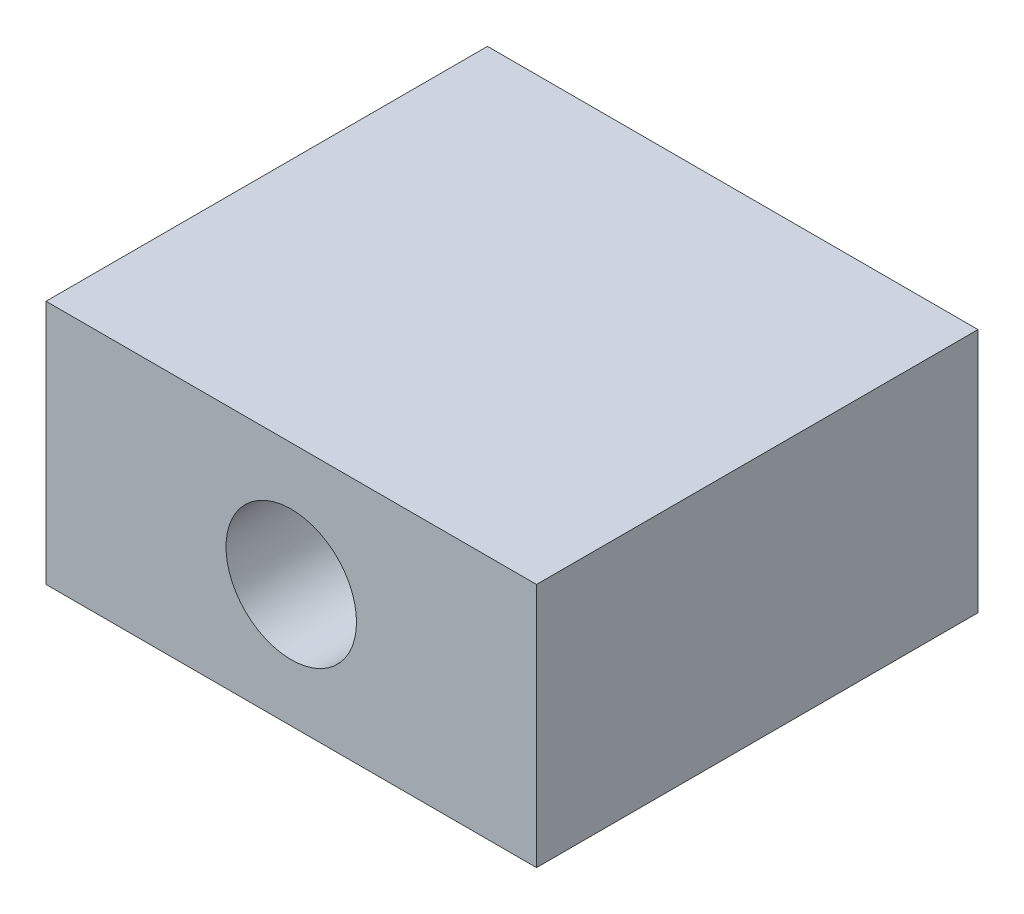
ISO-10303-21;
HEADER;
FILE_DESCRIPTION(('STEP AP214'),'2;1');
FILE_NAME('part.step','',(''),(''),'','','');
FILE_SCHEMA(('AUTOMOTIVE_DESIGN { 1 0 10303 214 1 1 1 1 }'));
ENDSEC;
DATA;
#1=APPLICATION_CONTEXT('core data for automotive mechanical design processes');
#2=APPLICATION_PROTOCOL_DEFINITION('international standard','automotive_design',2000,#1);
#3=PRODUCT_CONTEXT('',#1,'mechanical');
#4=PRODUCT('Part','Part','',(#3));
#5=PRODUCT_RELATED_PRODUCT_CATEGORY('part','',(#4));
#6=PRODUCT_DEFINITION_FORMATION('','',#4);
#7=PRODUCT_DEFINITION_CONTEXT('part definition',#1,'design');
#8=PRODUCT_DEFINITION('design','',#6,#7);
#9=PRODUCT_DEFINITION_SHAPE('','',#8);
#10=(LENGTH_UNIT() NAMED_UNIT(*) SI_UNIT(.MILLI.,.METRE.));
#11=(NAMED_UNIT(*) PLANE_ANGLE_UNIT() SI_UNIT($,.RADIAN.));
#12=(NAMED_UNIT(*) SI_UNIT($,.STERADIAN.) SOLID_ANGLE_UNIT());
#13=UNCERTAINTY_MEASURE_WITH_UNIT(LENGTH_MEASURE(1.E-05),#10,'distance_accuracy_value','');
#14=(GEOMETRIC_REPRESENTATION_CONTEXT(3) GLOBAL_UNCERTAINTY_ASSIGNED_CONTEXT((#13)) GLOBAL_UNIT_ASSIGNED_CONTEXT((#10,
#11,#12)) REPRESENTATION_CONTEXT('',''));
#15=CARTESIAN_POINT('',(0.,0.,0.));
#16=DIRECTION('',(0.,0.,1.));
#17=DIRECTION('',(1.,0.,0.));
#18=AXIS2_PLACEMENT_3D('',#15,#16,#17);
#19=CARTESIAN_POINT('',(12.7,-6.35,22.86));
#20=DIRECTION('',(-1.,0.,0.));
#21=DIRECTION('',(0.,0.,1.));
#22=AXIS2_PLACEMENT_3D('',#19,#20,#21);
#23=PLANE('',#22);
#24=DIRECTION('',(0.,1.,0.));
#25=VECTOR('',#24,1.);
#26=CARTESIAN_POINT('',(12.7,-6.35,0.));
#27=LINE('',#26,#25);
#28=CARTESIAN_POINT('',(12.7,-6.35,0.));
#29=VERTEX_POINT('',#28);
#30=CARTESIAN_POINT('',(12.7,6.35,0.));
#31=VERTEX_POINT('',#30);
#32=EDGE_CURVE('E97',#29,#31,#27,.T.);
#33=ORIENTED_EDGE('',*,*,#32,.T.);
#34=DIRECTION('',(0.,0.,-1.));
#35=VECTOR('',#34,1.);
#36=CARTESIAN_POINT('',(12.7,6.35,22.86));
#37=LINE('',#36,#35);
#38=CARTESIAN_POINT('',(12.7,6.35,22.86));
#39=VERTEX_POINT('',#38);
#40=EDGE_CURVE('E11',#39,#31,#37,.T.);
#41=ORIENTED_EDGE('',*,*,#40,.F.);
#42=DIRECTION('',(0.,1.,0.));
#43=VECTOR('',#42,1.);
#44=CARTESIAN_POINT('',(12.7,-6.35,22.86));
#45=LINE('',#44,#43);
#46=CARTESIAN_POINT('',(12.7,-6.35,22.86));
#47=VERTEX_POINT('',#46);
#48=EDGE_CURVE('E85',#47,#39,#45,.T.);
#49=ORIENTED_EDGE('',*,*,#48,.F.);
#50=DIRECTION('',(0.,0.,-1.));
#51=VECTOR('',#50,1.);
#52=CARTESIAN_POINT('',(12.7,-6.35,22.86));
#53=LINE('',#52,#51);
#54=EDGE_CURVE('E93',#47,#29,#53,.T.);
#55=ORIENTED_EDGE('',*,*,#54,.T.);
#56=EDGE_LOOP('',(#33,#41,#49,#55));
#57=FACE_BOUND('',#56,.T.);
#58=ADVANCED_FACE('F34',(#57),#23,.F.);
#59=CARTESIAN_POINT('',(-12.7,6.35,22.86));
#60=DIRECTION('',(0.,-1.,0.));
#61=DIRECTION('',(0.,0.,-1.));
#62=AXIS2_PLACEMENT_3D('',#59,#60,#61);
#63=PLANE('',#62);
#64=DIRECTION('',(-1.,0.,0.));
#65=VECTOR('',#64,1.);
#66=CARTESIAN_POINT('',(-12.7,6.35,0.));
#67=LINE('',#66,#65);
#68=CARTESIAN_POINT('',(-12.7,6.35,0.));
#69=VERTEX_POINT('',#68);
#70=EDGE_CURVE('E89',#31,#69,#67,.T.);
#71=ORIENTED_EDGE('',*,*,#70,.T.);
#72=DIRECTION('',(0.,0.,-1.));
#73=VECTOR('',#72,1.);
#74=CARTESIAN_POINT('',(-12.7,6.35,22.86));
#75=LINE('',#74,#73);
#76=CARTESIAN_POINT('',(-12.7,6.35,22.86));
#77=VERTEX_POINT('',#76);
#78=EDGE_CURVE('E42',#77,#69,#75,.T.);
#79=ORIENTED_EDGE('',*,*,#78,.F.);
#80=DIRECTION('',(-1.,0.,0.));
#81=VECTOR('',#80,1.);
#82=CARTESIAN_POINT('',(-12.7,6.35,22.86));
#83=LINE('',#82,#81);
#84=EDGE_CURVE('E80',#39,#77,#83,.T.);
#85=ORIENTED_EDGE('',*,*,#84,.F.);
#86=ORIENTED_EDGE('',*,*,#40,.T.);
#87=EDGE_LOOP('',(#71,#79,#85,#86));
#88=FACE_BOUND('',#87,.T.);
#89=ADVANCED_FACE('F88',(#88),#63,.F.);
#90=CARTESIAN_POINT('',(-12.7,-6.35,22.86));
#91=DIRECTION('',(1.,0.,0.));
#92=DIRECTION('',(0.,0.,-1.));
#93=AXIS2_PLACEMENT_3D('',#90,#91,#92);
#94=PLANE('',#93);
#95=DIRECTION('',(0.,-1.,0.));
#96=VECTOR('',#95,1.);
#97=CARTESIAN_POINT('',(-12.7,-6.35,0.));
#98=LINE('',#97,#96);
#99=CARTESIAN_POINT('',(-12.7,-6.35,0.));
#100=VERTEX_POINT('',#99);
#101=EDGE_CURVE('E67',#69,#100,#98,.T.);
#102=ORIENTED_EDGE('',*,*,#101,.T.);
#103=DIRECTION('',(0.,0.,-1.));
#104=VECTOR('',#103,1.);
#105=CARTESIAN_POINT('',(-12.7,-6.35,22.86));
#106=LINE('',#105,#104);
#107=CARTESIAN_POINT('',(-12.7,-6.35,22.86));
#108=VERTEX_POINT('',#107);
#109=EDGE_CURVE('E90',#108,#100,#106,.T.);
#110=ORIENTED_EDGE('',*,*,#109,.F.);
#111=DIRECTION('',(0.,-1.,0.));
#112=VECTOR('',#111,1.);
#113=CARTESIAN_POINT('',(-12.7,-6.35,22.86));
#114=LINE('',#113,#112);
#115=EDGE_CURVE('E83',#77,#108,#114,.T.);
#116=ORIENTED_EDGE('',*,*,#115,.F.);
#117=ORIENTED_EDGE('',*,*,#78,.T.);
#118=EDGE_LOOP('',(#102,#110,#116,#117));
#119=FACE_BOUND('',#118,.T.);
#120=ADVANCED_FACE('F91',(#119),#94,.F.);
#121=CARTESIAN_POINT('',(-12.7,-6.35,22.86));
#122=DIRECTION('',(0.,1.,0.));
#123=DIRECTION('',(0.,0.,1.));
#124=AXIS2_PLACEMENT_3D('',#121,#122,#123);
#125=PLANE('',#124);
#126=DIRECTION('',(1.,0.,0.));
#127=VECTOR('',#126,1.);
#128=CARTESIAN_POINT('',(-12.7,-6.35,0.));
#129=LINE('',#128,#127);
#130=EDGE_CURVE('E73',#100,#29,#129,.T.);
#131=ORIENTED_EDGE('',*,*,#130,.T.);
#132=ORIENTED_EDGE('',*,*,#54,.F.);
#133=DIRECTION('',(1.,0.,0.));
#134=VECTOR('',#133,1.);
#135=CARTESIAN_POINT('',(-12.7,-6.35,22.86));
#136=LINE('',#135,#134);
#137=EDGE_CURVE('E50',#108,#47,#136,.T.);
#138=ORIENTED_EDGE('',*,*,#137,.F.);
#139=ORIENTED_EDGE('',*,*,#109,.T.);
#140=EDGE_LOOP('',(#131,#132,#138,#139));
#141=FACE_BOUND('',#140,.T.);
#142=ADVANCED_FACE('F105',(#141),#125,.F.);
#143=CARTESIAN_POINT('',(12.7,6.35,22.86));
#144=DIRECTION('',(0.,0.,-1.));
#145=DIRECTION('',(-1.,0.,0.));
#146=AXIS2_PLACEMENT_3D('',#143,#144,#145);
#147=PLANE('',#146);
#148=CARTESIAN_POINT('',(0.,0.,22.86));
#149=DIRECTION('',(0.,0.,1.));
#150=DIRECTION('',(1.,0.,0.));
#151=AXIS2_PLACEMENT_3D('',#148,#149,#150);
#152=CIRCLE('',#151,3.37819999999999);
#153=CARTESIAN_POINT('',(3.37819999999999,0.,22.86));
#154=VERTEX_POINT('',#153);
#155=EDGE_CURVE('E113',#154,#154,#152,.T.);
#156=ORIENTED_EDGE('',*,*,#155,.F.);
#157=EDGE_LOOP('',(#156));
#158=FACE_BOUND('',#157,.T.);
#159=ORIENTED_EDGE('',*,*,#48,.T.);
#160=ORIENTED_EDGE('',*,*,#84,.T.);
#161=ORIENTED_EDGE('',*,*,#115,.T.);
#162=ORIENTED_EDGE('',*,*,#137,.T.);
#163=EDGE_LOOP('',(#159,#160,#161,#162));
#164=FACE_BOUND('',#163,.T.);
#165=ADVANCED_FACE('F81',(#158,#164),#147,.F.);
#166=CARTESIAN_POINT('',(12.7,6.35,0.));
#167=DIRECTION('',(0.,0.,-1.));
#168=DIRECTION('',(-1.,0.,0.));
#169=AXIS2_PLACEMENT_3D('',#166,#167,#168);
#170=PLANE('',#169);
#171=CARTESIAN_POINT('',(0.,0.,0.));
#172=DIRECTION('',(0.,0.,1.));
#173=DIRECTION('',(1.,0.,0.));
#174=AXIS2_PLACEMENT_3D('',#171,#172,#173);
#175=CIRCLE('',#174,3.3782);
#176=CARTESIAN_POINT('',(3.3782,0.,0.));
#177=VERTEX_POINT('',#176);
#178=EDGE_CURVE('E100',#177,#177,#175,.T.);
#179=ORIENTED_EDGE('',*,*,#178,.T.);
#180=EDGE_LOOP('',(#179));
#181=FACE_BOUND('',#180,.T.);
#182=ORIENTED_EDGE('',*,*,#32,.F.);
#183=ORIENTED_EDGE('',*,*,#130,.F.);
#184=ORIENTED_EDGE('',*,*,#101,.F.);
#185=ORIENTED_EDGE('',*,*,#70,.F.);
#186=EDGE_LOOP('',(#182,#183,#184,#185));
#187=FACE_BOUND('',#186,.T.);
#188=ADVANCED_FACE('F108',(#181,#187),#170,.T.);
#189=CARTESIAN_POINT('',(0.,0.,22.86));
#190=DIRECTION('',(0.,0.,1.));
#191=DIRECTION('',(1.,0.,0.));
#192=AXIS2_PLACEMENT_3D('',#189,#190,#191);
#193=CYLINDRICAL_SURFACE('',#192,3.37819999999999);
#194=ORIENTED_EDGE('',*,*,#178,.F.);
#195=EDGE_LOOP('',(#194));
#196=FACE_BOUND('',#195,.T.);
#197=ORIENTED_EDGE('',*,*,#155,.T.);
#198=EDGE_LOOP('',(#197));
#199=FACE_BOUND('',#198,.T.);
#200=ADVANCED_FACE('F117',(#196,#199),#193,.F.);
#201=CLOSED_SHELL('',(#58,#89,#120,#142,#165,#188,#200));
#202=MANIFOLD_SOLID_BREP('B2',#201);
#203=ADVANCED_BREP_SHAPE_REPRESENTATION('',(#18,#202),#14);
#204=SHAPE_DEFINITION_REPRESENTATION(#9,#203);
ENDSEC;
END-ISO-10303-21;
